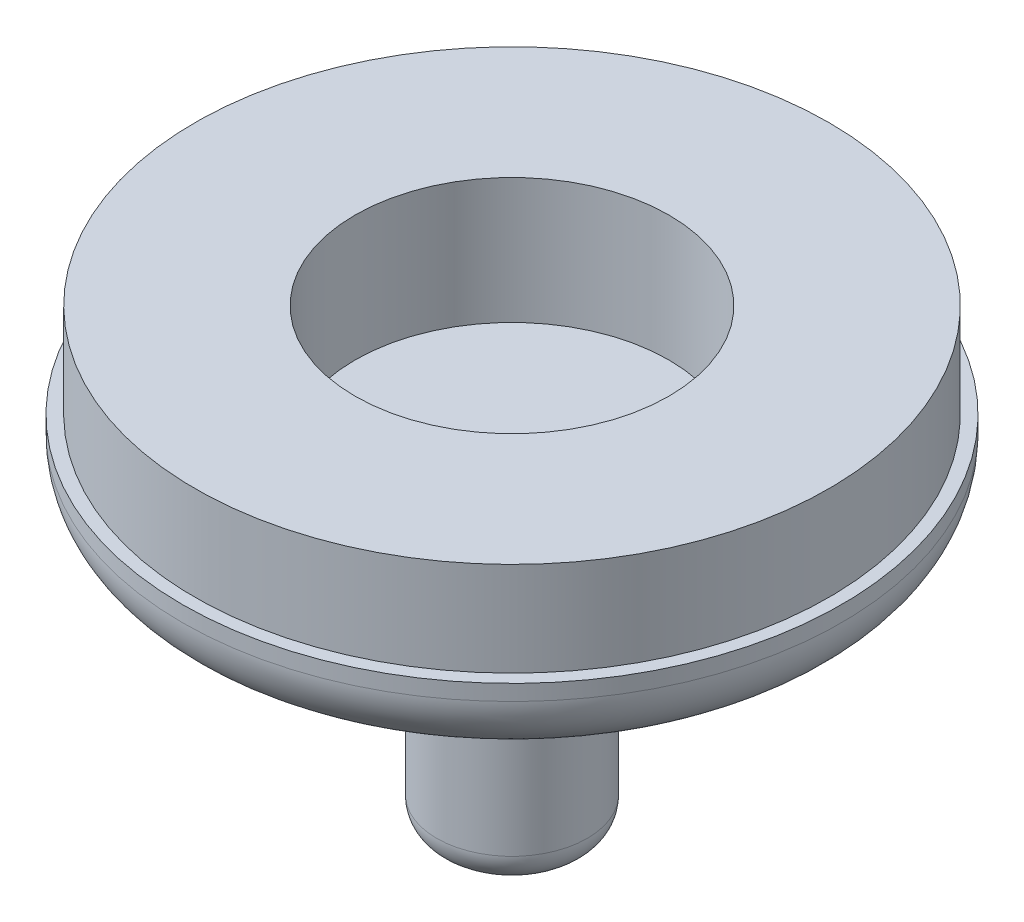
ISO-10303-21;
HEADER;
FILE_DESCRIPTION(('STEP AP214'),'2;1');
FILE_NAME('part.step','',(''),(''),'','','');
FILE_SCHEMA(('AUTOMOTIVE_DESIGN { 1 0 10303 214 1 1 1 1 }'));
ENDSEC;
DATA;
#1=APPLICATION_CONTEXT('core data for automotive mechanical design processes');
#2=APPLICATION_PROTOCOL_DEFINITION('international standard','automotive_design',2000,#1);
#3=PRODUCT_CONTEXT('',#1,'mechanical');
#4=PRODUCT('Part','Part','',(#3));
#5=PRODUCT_RELATED_PRODUCT_CATEGORY('part','',(#4));
#6=PRODUCT_DEFINITION_FORMATION('','',#4);
#7=PRODUCT_DEFINITION_CONTEXT('part definition',#1,'design');
#8=PRODUCT_DEFINITION('design','',#6,#7);
#9=PRODUCT_DEFINITION_SHAPE('','',#8);
#10=(LENGTH_UNIT() NAMED_UNIT(*) SI_UNIT(.MILLI.,.METRE.));
#11=(NAMED_UNIT(*) PLANE_ANGLE_UNIT() SI_UNIT($,.RADIAN.));
#12=(NAMED_UNIT(*) SI_UNIT($,.STERADIAN.) SOLID_ANGLE_UNIT());
#13=UNCERTAINTY_MEASURE_WITH_UNIT(LENGTH_MEASURE(1.E-05),#10,'distance_accuracy_value','');
#14=(GEOMETRIC_REPRESENTATION_CONTEXT(3) GLOBAL_UNCERTAINTY_ASSIGNED_CONTEXT((#13)) GLOBAL_UNIT_ASSIGNED_CONTEXT((#10,
#11,#12)) REPRESENTATION_CONTEXT('',''));
#15=CARTESIAN_POINT('',(0.,0.,0.));
#16=DIRECTION('',(0.,0.,1.));
#17=DIRECTION('',(1.,0.,0.));
#18=AXIS2_PLACEMENT_3D('',#15,#16,#17);
#19=CARTESIAN_POINT('',(0.,3.175,0.));
#20=DIRECTION('',(0.,-1.,0.));
#21=DIRECTION('',(0.,0.,-1.));
#22=AXIS2_PLACEMENT_3D('',#19,#20,#21);
#23=CYLINDRICAL_SURFACE('',#22,13.335);
#24=CARTESIAN_POINT('',(0.,2.54,0.));
#25=DIRECTION('',(0.,1.,0.));
#26=DIRECTION('',(0.,0.,1.));
#27=AXIS2_PLACEMENT_3D('',#24,#25,#26);
#28=CIRCLE('',#27,13.335);
#29=CARTESIAN_POINT('',(0.,2.54,13.335));
#30=VERTEX_POINT('',#29);
#31=EDGE_CURVE('E65',#30,#30,#28,.T.);
#32=ORIENTED_EDGE('',*,*,#31,.T.);
#33=EDGE_LOOP('',(#32));
#34=FACE_BOUND('',#33,.T.);
#35=CARTESIAN_POINT('',(0.,3.175,0.));
#36=DIRECTION('',(0.,1.,0.));
#37=DIRECTION('',(0.,0.,1.));
#38=AXIS2_PLACEMENT_3D('',#35,#36,#37);
#39=CIRCLE('',#38,13.335);
#40=CARTESIAN_POINT('',(0.,3.175,13.335));
#41=VERTEX_POINT('',#40);
#42=EDGE_CURVE('E70',#41,#41,#39,.T.);
#43=ORIENTED_EDGE('',*,*,#42,.F.);
#44=EDGE_LOOP('',(#43));
#45=FACE_BOUND('',#44,.T.);
#46=ADVANCED_FACE('F37',(#34,#45),#23,.T.);
#47=CARTESIAN_POINT('',(0.,3.175,0.));
#48=DIRECTION('',(0.,1.,0.));
#49=DIRECTION('',(0.,0.,1.));
#50=AXIS2_PLACEMENT_3D('',#47,#48,#49);
#51=PLANE('',#50);
#52=CARTESIAN_POINT('',(0.,3.175,0.));
#53=DIRECTION('',(0.,1.,0.));
#54=DIRECTION('',(0.,0.,1.));
#55=AXIS2_PLACEMENT_3D('',#52,#53,#54);
#56=CIRCLE('',#55,12.827);
#57=CARTESIAN_POINT('',(0.,3.175,-12.827));
#58=VERTEX_POINT('',#57);
#59=EDGE_CURVE('E69',#58,#58,#56,.T.);
#60=ORIENTED_EDGE('',*,*,#59,.F.);
#61=EDGE_LOOP('',(#60));
#62=FACE_BOUND('',#61,.T.);
#63=ORIENTED_EDGE('',*,*,#42,.T.);
#64=EDGE_LOOP('',(#63));
#65=FACE_BOUND('',#64,.T.);
#66=ADVANCED_FACE('F111',(#62,#65),#51,.T.);
#67=CARTESIAN_POINT('',(0.,0.,0.));
#68=DIRECTION('',(0.,1.,0.));
#69=DIRECTION('',(0.,0.,1.));
#70=AXIS2_PLACEMENT_3D('',#67,#68,#69);
#71=PLANE('',#70);
#72=CARTESIAN_POINT('',(0.,0.,0.));
#73=DIRECTION('',(0.,1.,0.));
#74=DIRECTION('',(0.,0.,1.));
#75=AXIS2_PLACEMENT_3D('',#72,#73,#74);
#76=CIRCLE('',#75,4.318);
#77=CARTESIAN_POINT('',(0.,0.,4.318));
#78=VERTEX_POINT('',#77);
#79=EDGE_CURVE('E10',#78,#78,#76,.T.);
#80=ORIENTED_EDGE('',*,*,#79,.T.);
#81=EDGE_LOOP('',(#80));
#82=FACE_BOUND('',#81,.T.);
#83=CARTESIAN_POINT('',(0.,0.,0.));
#84=DIRECTION('',(0.,1.,0.));
#85=DIRECTION('',(0.,0.,1.));
#86=AXIS2_PLACEMENT_3D('',#83,#84,#85);
#87=CIRCLE('',#86,10.795);
#88=CARTESIAN_POINT('',(0.,0.,10.795));
#89=VERTEX_POINT('',#88);
#90=EDGE_CURVE('E61',#89,#89,#87,.F.);
#91=ORIENTED_EDGE('',*,*,#90,.T.);
#92=EDGE_LOOP('',(#91));
#93=FACE_BOUND('',#92,.T.);
#94=ADVANCED_FACE('F107',(#82,#93),#71,.F.);
#95=CARTESIAN_POINT('',(0.,6.985,0.));
#96=DIRECTION('',(0.,-1.,0.));
#97=DIRECTION('',(0.,0.,-1.));
#98=AXIS2_PLACEMENT_3D('',#95,#96,#97);
#99=CYLINDRICAL_SURFACE('',#98,12.827);
#100=CARTESIAN_POINT('',(0.,6.985,0.));
#101=DIRECTION('',(0.,1.,0.));
#102=DIRECTION('',(0.,0.,1.));
#103=AXIS2_PLACEMENT_3D('',#100,#101,#102);
#104=CIRCLE('',#103,12.827);
#105=CARTESIAN_POINT('',(0.,6.985,-12.827));
#106=VERTEX_POINT('',#105);
#107=EDGE_CURVE('E74',#106,#106,#104,.T.);
#108=CARTESIAN_POINT('',(0.,6.985,-12.827));
#109=CARTESIAN_POINT('',(0.,6.9453125,-12.827));
#110=CARTESIAN_POINT('',(0.,6.905625,-12.827));
#111=CARTESIAN_POINT('',(0.,6.82625,-12.827));
#112=CARTESIAN_POINT('',(0.,6.7865625,-12.827));
#113=CARTESIAN_POINT('',(0.,6.7071875,-12.827));
#114=CARTESIAN_POINT('',(0.,6.6675,-12.827));
#115=CARTESIAN_POINT('',(0.,6.588125,-12.827));
#116=CARTESIAN_POINT('',(0.,6.5484375,-12.827));
#117=CARTESIAN_POINT('',(0.,6.4690625,-12.827));
#118=CARTESIAN_POINT('',(0.,6.429375,-12.827));
#119=CARTESIAN_POINT('',(0.,6.35,-12.827));
#120=CARTESIAN_POINT('',(0.,6.3103125,-12.827));
#121=CARTESIAN_POINT('',(0.,6.2309375,-12.827));
#122=CARTESIAN_POINT('',(0.,6.19125,-12.827));
#123=CARTESIAN_POINT('',(0.,6.111875,-12.827));
#124=CARTESIAN_POINT('',(0.,6.0721875,-12.827));
#125=CARTESIAN_POINT('',(0.,5.9928125,-12.827));
#126=CARTESIAN_POINT('',(0.,5.953125,-12.827));
#127=CARTESIAN_POINT('',(0.,5.87375,-12.827));
#128=CARTESIAN_POINT('',(0.,5.8340625,-12.827));
#129=CARTESIAN_POINT('',(0.,5.7546875,-12.827));
#130=CARTESIAN_POINT('',(0.,5.715,-12.827));
#131=CARTESIAN_POINT('',(0.,5.635625,-12.827));
#132=CARTESIAN_POINT('',(0.,5.5959375,-12.827));
#133=CARTESIAN_POINT('',(0.,5.5165625,-12.827));
#134=CARTESIAN_POINT('',(0.,5.476875,-12.827));
#135=CARTESIAN_POINT('',(0.,5.3975,-12.827));
#136=CARTESIAN_POINT('',(0.,5.3578125,-12.827));
#137=CARTESIAN_POINT('',(0.,5.2784375,-12.827));
#138=CARTESIAN_POINT('',(0.,5.23875,-12.827));
#139=CARTESIAN_POINT('',(0.,5.159375,-12.827));
#140=CARTESIAN_POINT('',(0.,5.1196875,-12.827));
#141=CARTESIAN_POINT('',(0.,5.0403125,-12.827));
#142=CARTESIAN_POINT('',(0.,5.000625,-12.827));
#143=CARTESIAN_POINT('',(0.,4.92125,-12.827));
#144=CARTESIAN_POINT('',(0.,4.8815625,-12.827));
#145=CARTESIAN_POINT('',(0.,4.8021875,-12.827));
#146=CARTESIAN_POINT('',(0.,4.7625,-12.827));
#147=CARTESIAN_POINT('',(0.,4.683125,-12.827));
#148=CARTESIAN_POINT('',(0.,4.6434375,-12.827));
#149=CARTESIAN_POINT('',(0.,4.5640625,-12.827));
#150=CARTESIAN_POINT('',(0.,4.524375,-12.827));
#151=CARTESIAN_POINT('',(0.,4.445,-12.827));
#152=CARTESIAN_POINT('',(0.,4.4053125,-12.827));
#153=CARTESIAN_POINT('',(0.,4.3259375,-12.827));
#154=CARTESIAN_POINT('',(0.,4.28625,-12.827));
#155=CARTESIAN_POINT('',(0.,4.206875,-12.827));
#156=CARTESIAN_POINT('',(0.,4.1671875,-12.827));
#157=CARTESIAN_POINT('',(0.,4.0878125,-12.827));
#158=CARTESIAN_POINT('',(0.,4.048125,-12.827));
#159=CARTESIAN_POINT('',(0.,3.96875,-12.827));
#160=CARTESIAN_POINT('',(0.,3.9290625,-12.827));
#161=CARTESIAN_POINT('',(0.,3.8496875,-12.827));
#162=CARTESIAN_POINT('',(0.,3.81,-12.827));
#163=CARTESIAN_POINT('',(0.,3.730625,-12.827));
#164=CARTESIAN_POINT('',(0.,3.6909375,-12.827));
#165=CARTESIAN_POINT('',(0.,3.6115625,-12.827));
#166=CARTESIAN_POINT('',(0.,3.571875,-12.827));
#167=CARTESIAN_POINT('',(0.,3.4925,-12.827));
#168=CARTESIAN_POINT('',(0.,3.4528125,-12.827));
#169=CARTESIAN_POINT('',(0.,3.3734375,-12.827));
#170=CARTESIAN_POINT('',(0.,3.33375,-12.827));
#171=CARTESIAN_POINT('',(0.,3.254375,-12.827));
#172=CARTESIAN_POINT('',(0.,3.2146875,-12.827));
#173=CARTESIAN_POINT('',(0.,3.175,-12.827));
#174=B_SPLINE_CURVE_WITH_KNOTS('',3,(#108,#109,#110,#111,#112,#113,#114,#115,#116,#117,#118,
#119,#120,#121,#122,#123,#124,#125,#126,#127,#128,#129,#130,#131,#132,#133,#134,#135,#136,#137,
#138,#139,#140,#141,#142,#143,#144,#145,#146,#147,#148,#149,#150,#151,#152,#153,#154,#155,#156,
#157,#158,#159,#160,#161,#162,#163,#164,#165,#166,#167,#168,#169,#170,#171,#172,#173),
.UNSPECIFIED.,.F.,.F.,(4,2,2,2,2,2,2,2,2,2,2,2,2,2,2,2,2,2,2,2,2,2,2,2,2,2,2,2,2,2,2,2,4),(0.,
0.119062499999999,0.238125,0.3571875,0.476249999999999,0.595312499999999,0.714375,0.8334375,
0.952499999999999,1.0715625,1.190625,1.3096875,1.42875,1.5478125,1.666875,1.7859375,1.905,
2.0240625,2.143125,2.2621875,2.38125,2.5003125,2.619375,2.7384375,2.8575,2.9765625,3.095625,
3.2146875,3.33375,3.4528125,3.571875,3.6909375,3.81),.UNSPECIFIED.);
#175=EDGE_CURVE('BSEAM101',#106,#58,#174,.T.);
#176=ORIENTED_EDGE('',*,*,#107,.F.);
#177=ORIENTED_EDGE('',*,*,#59,.T.);
#178=ORIENTED_EDGE('',*,*,#175,.T.);
#179=ORIENTED_EDGE('',*,*,#175,.F.);
#180=EDGE_LOOP('',(#176,#178,#177,#179));
#181=FACE_BOUND('',#180,.T.);
#182=ADVANCED_FACE('F101',(#181),#99,.T.);
#183=CARTESIAN_POINT('',(0.,6.985,0.));
#184=DIRECTION('',(0.,1.,0.));
#185=DIRECTION('',(0.,0.,1.));
#186=AXIS2_PLACEMENT_3D('',#183,#184,#185);
#187=PLANE('',#186);
#188=CARTESIAN_POINT('',(0.,6.985,0.));
#189=DIRECTION('',(0.,1.,0.));
#190=DIRECTION('',(0.,0.,1.));
#191=AXIS2_PLACEMENT_3D('',#188,#189,#190);
#192=CIRCLE('',#191,6.35);
#193=CARTESIAN_POINT('',(0.,6.985,6.35));
#194=VERTEX_POINT('',#193);
#195=EDGE_CURVE('E82',#194,#194,#192,.T.);
#196=ORIENTED_EDGE('',*,*,#195,.F.);
#197=EDGE_LOOP('',(#196));
#198=FACE_BOUND('',#197,.T.);
#199=ORIENTED_EDGE('',*,*,#107,.T.);
#200=EDGE_LOOP('',(#199));
#201=FACE_BOUND('',#200,.T.);
#202=ADVANCED_FACE('F95',(#198,#201),#187,.T.);
#203=CARTESIAN_POINT('',(0.,1.905,0.));
#204=DIRECTION('',(0.,1.,0.));
#205=DIRECTION('',(0.,0.,1.));
#206=AXIS2_PLACEMENT_3D('',#203,#204,#205);
#207=CYLINDRICAL_SURFACE('',#206,6.35);
#208=CARTESIAN_POINT('',(0.,1.905,0.));
#209=DIRECTION('',(0.,1.,0.));
#210=DIRECTION('',(0.,0.,1.));
#211=AXIS2_PLACEMENT_3D('',#208,#209,#210);
#212=CIRCLE('',#211,6.35);
#213=CARTESIAN_POINT('',(0.,1.905,6.35));
#214=VERTEX_POINT('',#213);
#215=EDGE_CURVE('E81',#214,#214,#212,.T.);
#216=ORIENTED_EDGE('',*,*,#215,.F.);
#217=EDGE_LOOP('',(#216));
#218=FACE_BOUND('',#217,.T.);
#219=ORIENTED_EDGE('',*,*,#195,.T.);
#220=EDGE_LOOP('',(#219));
#221=FACE_BOUND('',#220,.T.);
#222=ADVANCED_FACE('F92',(#218,#221),#207,.F.);
#223=CARTESIAN_POINT('',(0.,1.905,0.));
#224=DIRECTION('',(0.,1.,0.));
#225=DIRECTION('',(0.,0.,1.));
#226=AXIS2_PLACEMENT_3D('',#223,#224,#225);
#227=PLANE('',#226);
#228=ORIENTED_EDGE('',*,*,#215,.T.);
#229=EDGE_LOOP('',(#228));
#230=FACE_BOUND('',#229,.T.);
#231=ADVANCED_FACE('F90',(#230),#227,.T.);
#232=CARTESIAN_POINT('',(0.,2.54,0.));
#233=DIRECTION('',(0.,1.,0.));
#234=DIRECTION('',(0.,0.,1.));
#235=AXIS2_PLACEMENT_3D('',#232,#233,#234);
#236=TOROIDAL_SURFACE('',#235,10.795,2.54);
#237=ORIENTED_EDGE('',*,*,#90,.F.);
#238=EDGE_LOOP('',(#237));
#239=FACE_BOUND('',#238,.T.);
#240=ORIENTED_EDGE('',*,*,#31,.F.);
#241=EDGE_LOOP('',(#240));
#242=FACE_BOUND('',#241,.T.);
#243=ADVANCED_FACE('F124',(#239,#242),#236,.T.);
#244=CARTESIAN_POINT('',(0.,-11.43,0.));
#245=DIRECTION('',(0.,1.,0.));
#246=DIRECTION('',(0.,0.,1.));
#247=AXIS2_PLACEMENT_3D('',#244,#245,#246);
#248=CYLINDRICAL_SURFACE('',#247,3.048);
#249=CARTESIAN_POINT('',(0.,-1.27,0.));
#250=DIRECTION('',(0.,1.,0.));
#251=DIRECTION('',(0.,0.,1.));
#252=AXIS2_PLACEMENT_3D('',#249,#250,#251);
#253=CIRCLE('',#252,3.048);
#254=CARTESIAN_POINT('',(0.,-1.27,3.048));
#255=VERTEX_POINT('',#254);
#256=EDGE_CURVE('E45',#255,#255,#253,.F.);
#257=ORIENTED_EDGE('',*,*,#256,.T.);
#258=EDGE_LOOP('',(#257));
#259=FACE_BOUND('',#258,.T.);
#260=CARTESIAN_POINT('',(0.,-10.16,0.));
#261=DIRECTION('',(0.,-1.,0.));
#262=DIRECTION('',(0.,0.,-1.));
#263=AXIS2_PLACEMENT_3D('',#260,#261,#262);
#264=CIRCLE('',#263,3.048);
#265=CARTESIAN_POINT('',(0.,-10.16,-3.048));
#266=VERTEX_POINT('',#265);
#267=EDGE_CURVE('E50',#266,#266,#264,.F.);
#268=ORIENTED_EDGE('',*,*,#267,.T.);
#269=EDGE_LOOP('',(#268));
#270=FACE_BOUND('',#269,.T.);
#271=ADVANCED_FACE('F126',(#259,#270),#248,.T.);
#272=CARTESIAN_POINT('',(0.,-11.43,0.));
#273=DIRECTION('',(0.,-1.,0.));
#274=DIRECTION('',(0.,0.,-1.));
#275=AXIS2_PLACEMENT_3D('',#272,#273,#274);
#276=PLANE('',#275);
#277=CARTESIAN_POINT('',(0.,-11.43,0.));
#278=DIRECTION('',(0.,-1.,0.));
#279=DIRECTION('',(0.,0.,-1.));
#280=AXIS2_PLACEMENT_3D('',#277,#278,#279);
#281=CIRCLE('',#280,1.778);
#282=CARTESIAN_POINT('',(0.,-11.43,-1.778));
#283=VERTEX_POINT('',#282);
#284=EDGE_CURVE('E55',#283,#283,#281,.T.);
#285=ORIENTED_EDGE('',*,*,#284,.T.);
#286=EDGE_LOOP('',(#285));
#287=FACE_BOUND('',#286,.T.);
#288=ADVANCED_FACE('F130',(#287),#276,.T.);
#289=CARTESIAN_POINT('',(0.,-10.16,0.));
#290=DIRECTION('',(0.,-1.,0.));
#291=DIRECTION('',(0.,0.,-1.));
#292=AXIS2_PLACEMENT_3D('',#289,#290,#291);
#293=TOROIDAL_SURFACE('',#292,1.778,1.27);
#294=ORIENTED_EDGE('',*,*,#267,.F.);
#295=EDGE_LOOP('',(#294));
#296=FACE_BOUND('',#295,.T.);
#297=ORIENTED_EDGE('',*,*,#284,.F.);
#298=EDGE_LOOP('',(#297));
#299=FACE_BOUND('',#298,.T.);
#300=ADVANCED_FACE('F128',(#296,#299),#293,.T.);
#301=CARTESIAN_POINT('',(0.,-1.27,0.));
#302=DIRECTION('',(0.,1.,0.));
#303=DIRECTION('',(0.,0.,1.));
#304=AXIS2_PLACEMENT_3D('',#301,#302,#303);
#305=TOROIDAL_SURFACE('',#304,4.318,1.27);
#306=ORIENTED_EDGE('',*,*,#79,.F.);
#307=EDGE_LOOP('',(#306));
#308=FACE_BOUND('',#307,.T.);
#309=ORIENTED_EDGE('',*,*,#256,.F.);
#310=EDGE_LOOP('',(#309));
#311=FACE_BOUND('',#310,.T.);
#312=ADVANCED_FACE('F39',(#308,#311),#305,.F.);
#313=CLOSED_SHELL('',(#46,#66,#94,#182,#202,#222,#231,#243,#271,#288,#300,#312));
#314=MANIFOLD_SOLID_BREP('B2',#313);
#315=ADVANCED_BREP_SHAPE_REPRESENTATION('',(#18,#314),#14);
#316=SHAPE_DEFINITION_REPRESENTATION(#9,#315);
ENDSEC;
END-ISO-10303-21;
